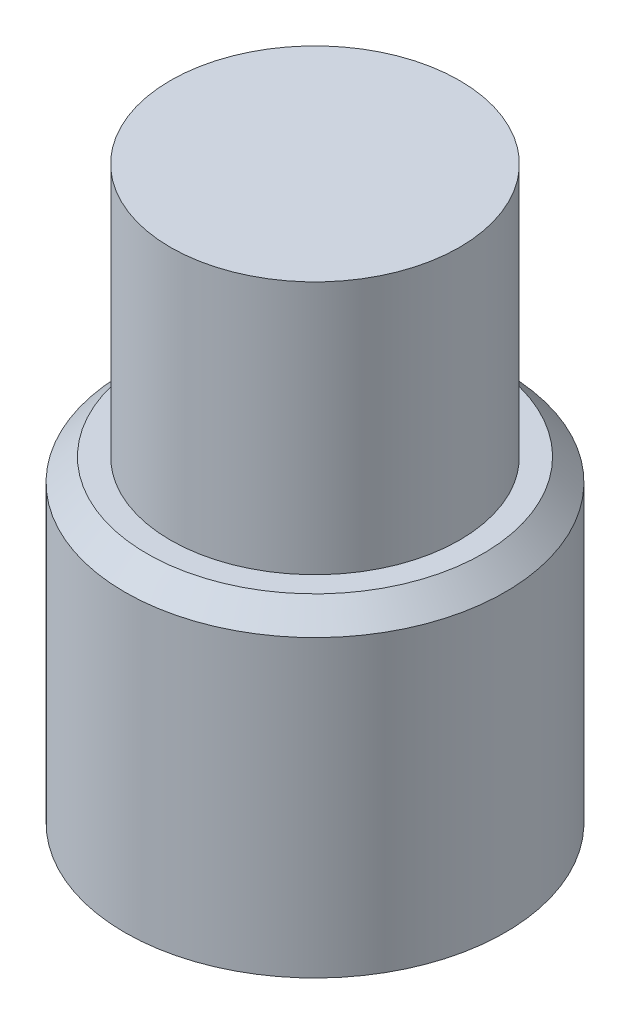
ISO-10303-21;
HEADER;
FILE_DESCRIPTION(('STEP AP214'),'2;1');
FILE_NAME('part.step','',(''),(''),'','','');
FILE_SCHEMA(('AUTOMOTIVE_DESIGN { 1 0 10303 214 1 1 1 1 }'));
ENDSEC;
DATA;
#1=APPLICATION_CONTEXT('core data for automotive mechanical design processes');
#2=APPLICATION_PROTOCOL_DEFINITION('international standard','automotive_design',2000,#1);
#3=PRODUCT_CONTEXT('',#1,'mechanical');
#4=PRODUCT('Part','Part','',(#3));
#5=PRODUCT_RELATED_PRODUCT_CATEGORY('part','',(#4));
#6=PRODUCT_DEFINITION_FORMATION('','',#4);
#7=PRODUCT_DEFINITION_CONTEXT('part definition',#1,'design');
#8=PRODUCT_DEFINITION('design','',#6,#7);
#9=PRODUCT_DEFINITION_SHAPE('','',#8);
#10=(LENGTH_UNIT() NAMED_UNIT(*) SI_UNIT(.MILLI.,.METRE.));
#11=(NAMED_UNIT(*) PLANE_ANGLE_UNIT() SI_UNIT($,.RADIAN.));
#12=(NAMED_UNIT(*) SI_UNIT($,.STERADIAN.) SOLID_ANGLE_UNIT());
#13=UNCERTAINTY_MEASURE_WITH_UNIT(LENGTH_MEASURE(1.E-05),#10,'distance_accuracy_value','');
#14=(GEOMETRIC_REPRESENTATION_CONTEXT(3) GLOBAL_UNCERTAINTY_ASSIGNED_CONTEXT((#13)) GLOBAL_UNIT_ASSIGNED_CONTEXT((#10,
#11,#12)) REPRESENTATION_CONTEXT('',''));
#15=CARTESIAN_POINT('',(0.,0.,0.));
#16=DIRECTION('',(0.,0.,1.));
#17=DIRECTION('',(1.,0.,0.));
#18=AXIS2_PLACEMENT_3D('',#15,#16,#17);
#19=CARTESIAN_POINT('',(0.,9.,0.));
#20=DIRECTION('',(0.,-1.,0.));
#21=DIRECTION('',(0.,0.,-1.));
#22=AXIS2_PLACEMENT_3D('',#19,#20,#21);
#23=CYLINDRICAL_SURFACE('',#22,2.28);
#24=CARTESIAN_POINT('',(0.,9.,0.));
#25=DIRECTION('',(0.,1.,0.));
#26=DIRECTION('',(0.,0.,1.));
#27=AXIS2_PLACEMENT_3D('',#24,#25,#26);
#28=CIRCLE('',#27,2.28);
#29=CARTESIAN_POINT('',(0.,9.,2.28));
#30=VERTEX_POINT('',#29);
#31=EDGE_CURVE('E58',#30,#30,#28,.T.);
#32=ORIENTED_EDGE('',*,*,#31,.F.);
#33=EDGE_LOOP('',(#32));
#34=FACE_BOUND('',#33,.T.);
#35=CARTESIAN_POINT('',(0.,5.,0.));
#36=DIRECTION('',(0.,-1.,0.));
#37=DIRECTION('',(0.,0.,-1.));
#38=AXIS2_PLACEMENT_3D('',#35,#36,#37);
#39=CIRCLE('',#38,2.28);
#40=CARTESIAN_POINT('',(0.,5.,-2.28));
#41=VERTEX_POINT('',#40);
#42=EDGE_CURVE('E53',#41,#41,#39,.T.);
#43=ORIENTED_EDGE('',*,*,#42,.F.);
#44=EDGE_LOOP('',(#43));
#45=FACE_BOUND('',#44,.T.);
#46=ADVANCED_FACE('F39',(#34,#45),#23,.T.);
#47=CARTESIAN_POINT('',(0.,9.,0.));
#48=DIRECTION('',(0.,1.,0.));
#49=DIRECTION('',(0.,0.,1.));
#50=AXIS2_PLACEMENT_3D('',#47,#48,#49);
#51=PLANE('',#50);
#52=ORIENTED_EDGE('',*,*,#31,.T.);
#53=EDGE_LOOP('',(#52));
#54=FACE_BOUND('',#53,.T.);
#55=ADVANCED_FACE('F74',(#54),#51,.T.);
#56=CARTESIAN_POINT('',(0.,5.,0.));
#57=DIRECTION('',(0.,-1.,0.));
#58=DIRECTION('',(0.,0.,-1.));
#59=AXIS2_PLACEMENT_3D('',#56,#57,#58);
#60=CYLINDRICAL_SURFACE('',#59,3.);
#61=CARTESIAN_POINT('',(0.,4.65,0.));
#62=DIRECTION('',(0.,-1.,0.));
#63=DIRECTION('',(0.,0.,-1.));
#64=AXIS2_PLACEMENT_3D('',#61,#62,#63);
#65=CIRCLE('',#64,3.);
#66=CARTESIAN_POINT('',(0.,4.65,-3.));
#67=VERTEX_POINT('',#66);
#68=EDGE_CURVE('E48',#67,#67,#65,.T.);
#69=ORIENTED_EDGE('',*,*,#68,.T.);
#70=EDGE_LOOP('',(#69));
#71=FACE_BOUND('',#70,.T.);
#72=CARTESIAN_POINT('',(0.,0.,0.));
#73=DIRECTION('',(0.,-1.,0.));
#74=DIRECTION('',(0.,0.,-1.));
#75=AXIS2_PLACEMENT_3D('',#72,#73,#74);
#76=CIRCLE('',#75,3.);
#77=CARTESIAN_POINT('',(0.,0.,-3.));
#78=VERTEX_POINT('',#77);
#79=EDGE_CURVE('E64',#78,#78,#76,.T.);
#80=ORIENTED_EDGE('',*,*,#79,.F.);
#81=EDGE_LOOP('',(#80));
#82=FACE_BOUND('',#81,.T.);
#83=ADVANCED_FACE('F71',(#71,#82),#60,.T.);
#84=CARTESIAN_POINT('',(0.,5.,0.));
#85=DIRECTION('',(0.,-1.,0.));
#86=DIRECTION('',(0.,0.,-1.));
#87=AXIS2_PLACEMENT_3D('',#84,#85,#86);
#88=PLANE('',#87);
#89=CARTESIAN_POINT('',(0.,5.,0.));
#90=DIRECTION('',(0.,-1.,0.));
#91=DIRECTION('',(0.,0.,-1.));
#92=AXIS2_PLACEMENT_3D('',#89,#90,#91);
#93=CIRCLE('',#92,2.65);
#94=CARTESIAN_POINT('',(0.,5.,-2.65));
#95=VERTEX_POINT('',#94);
#96=EDGE_CURVE('E10',#95,#95,#93,.F.);
#97=ORIENTED_EDGE('',*,*,#96,.T.);
#98=EDGE_LOOP('',(#97));
#99=FACE_BOUND('',#98,.T.);
#100=ORIENTED_EDGE('',*,*,#42,.T.);
#101=EDGE_LOOP('',(#100));
#102=FACE_BOUND('',#101,.T.);
#103=ADVANCED_FACE('F73',(#99,#102),#88,.F.);
#104=CARTESIAN_POINT('',(0.,0.,0.));
#105=DIRECTION('',(0.,1.,0.));
#106=DIRECTION('',(0.,0.,1.));
#107=AXIS2_PLACEMENT_3D('',#104,#105,#106);
#108=PLANE('',#107);
#109=ORIENTED_EDGE('',*,*,#79,.T.);
#110=EDGE_LOOP('',(#109));
#111=FACE_BOUND('',#110,.T.);
#112=ADVANCED_FACE('F69',(#111),#108,.F.);
#113=CARTESIAN_POINT('',(0.,4.65,0.));
#114=DIRECTION('',(0.,-1.,0.));
#115=DIRECTION('',(0.,0.,-1.));
#116=AXIS2_PLACEMENT_3D('',#113,#114,#115);
#117=CONICAL_SURFACE('',#116,3.,0.785398163397448);
#118=ORIENTED_EDGE('',*,*,#96,.F.);
#119=EDGE_LOOP('',(#118));
#120=FACE_BOUND('',#119,.T.);
#121=ORIENTED_EDGE('',*,*,#68,.F.);
#122=EDGE_LOOP('',(#121));
#123=FACE_BOUND('',#122,.T.);
#124=ADVANCED_FACE('F42',(#120,#123),#117,.T.);
#125=CLOSED_SHELL('',(#46,#55,#83,#103,#112,#124));
#126=MANIFOLD_SOLID_BREP('B2',#125);
#127=ADVANCED_BREP_SHAPE_REPRESENTATION('',(#18,#126),#14);
#128=SHAPE_DEFINITION_REPRESENTATION(#9,#127);
ENDSEC;
END-ISO-10303-21;
